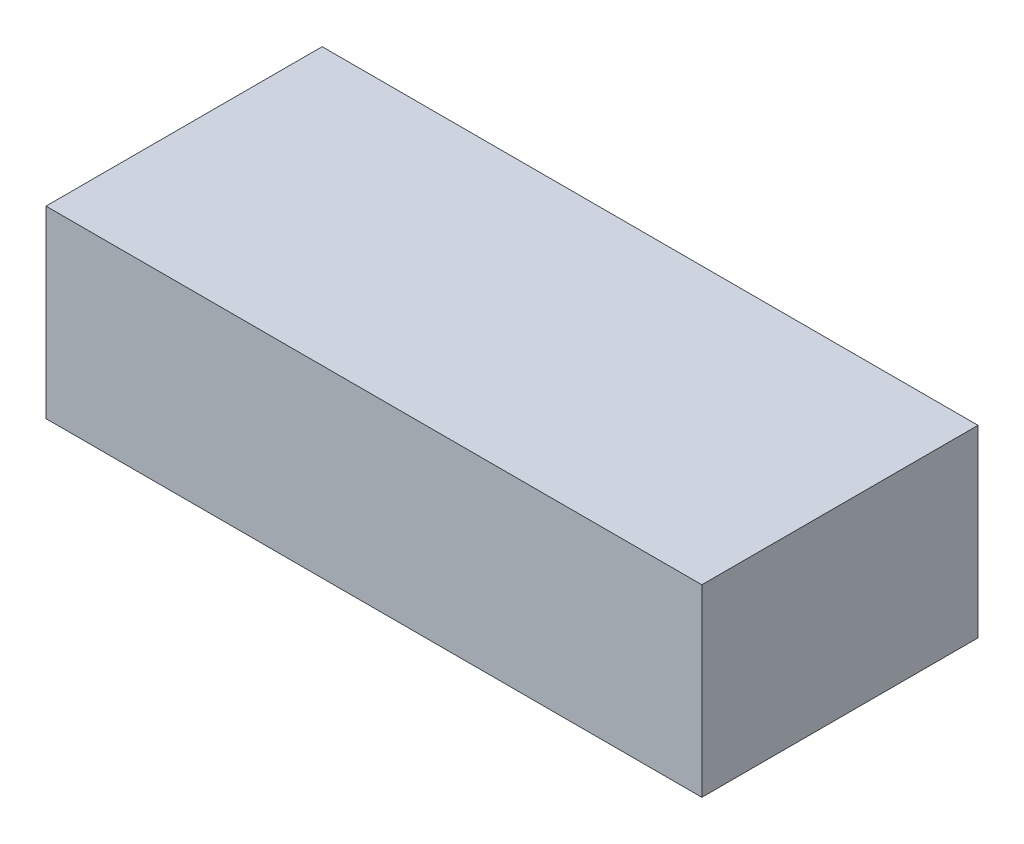
ISO-10303-21;
HEADER;
FILE_DESCRIPTION(('STEP AP214'),'2;1');
FILE_NAME('part.step','',(''),(''),'','','');
FILE_SCHEMA(('AUTOMOTIVE_DESIGN { 1 0 10303 214 1 1 1 1 }'));
ENDSEC;
DATA;
#1=APPLICATION_CONTEXT('core data for automotive mechanical design processes');
#2=APPLICATION_PROTOCOL_DEFINITION('international standard','automotive_design',2000,#1);
#3=PRODUCT_CONTEXT('',#1,'mechanical');
#4=PRODUCT('Part','Part','',(#3));
#5=PRODUCT_RELATED_PRODUCT_CATEGORY('part','',(#4));
#6=PRODUCT_DEFINITION_FORMATION('','',#4);
#7=PRODUCT_DEFINITION_CONTEXT('part definition',#1,'design');
#8=PRODUCT_DEFINITION('design','',#6,#7);
#9=PRODUCT_DEFINITION_SHAPE('','',#8);
#10=(LENGTH_UNIT() NAMED_UNIT(*) SI_UNIT(.MILLI.,.METRE.));
#11=(NAMED_UNIT(*) PLANE_ANGLE_UNIT() SI_UNIT($,.RADIAN.));
#12=(NAMED_UNIT(*) SI_UNIT($,.STERADIAN.) SOLID_ANGLE_UNIT());
#13=UNCERTAINTY_MEASURE_WITH_UNIT(LENGTH_MEASURE(1.E-05),#10,'distance_accuracy_value','');
#14=(GEOMETRIC_REPRESENTATION_CONTEXT(3) GLOBAL_UNCERTAINTY_ASSIGNED_CONTEXT((#13)) GLOBAL_UNIT_ASSIGNED_CONTEXT((#10,
#11,#12)) REPRESENTATION_CONTEXT('',''));
#15=CARTESIAN_POINT('',(0.,0.,0.));
#16=DIRECTION('',(0.,0.,1.));
#17=DIRECTION('',(1.,0.,0.));
#18=AXIS2_PLACEMENT_3D('',#15,#16,#17);
#19=CARTESIAN_POINT('',(0.,101.6,0.));
#20=DIRECTION('',(1.,0.,0.));
#21=DIRECTION('',(0.,0.,-1.));
#22=AXIS2_PLACEMENT_3D('',#19,#20,#21);
#23=PLANE('',#22);
#24=DIRECTION('',(0.,0.,1.));
#25=VECTOR('',#24,1.);
#26=CARTESIAN_POINT('',(0.,0.,0.));
#27=LINE('',#26,#25);
#28=CARTESIAN_POINT('',(0.,0.,-152.4));
#29=VERTEX_POINT('',#28);
#30=CARTESIAN_POINT('',(0.,0.,0.));
#31=VERTEX_POINT('',#30);
#32=EDGE_CURVE('E102',#29,#31,#27,.T.);
#33=ORIENTED_EDGE('',*,*,#32,.T.);
#34=DIRECTION('',(0.,-1.,0.));
#35=VECTOR('',#34,1.);
#36=CARTESIAN_POINT('',(0.,101.6,0.));
#37=LINE('',#36,#35);
#38=CARTESIAN_POINT('',(0.,101.6,0.));
#39=VERTEX_POINT('',#38);
#40=EDGE_CURVE('E11',#39,#31,#37,.T.);
#41=ORIENTED_EDGE('',*,*,#40,.F.);
#42=DIRECTION('',(0.,0.,1.));
#43=VECTOR('',#42,1.);
#44=CARTESIAN_POINT('',(0.,101.6,0.));
#45=LINE('',#44,#43);
#46=CARTESIAN_POINT('',(0.,101.6,-152.4));
#47=VERTEX_POINT('',#46);
#48=EDGE_CURVE('E90',#47,#39,#45,.T.);
#49=ORIENTED_EDGE('',*,*,#48,.F.);
#50=DIRECTION('',(0.,-1.,0.));
#51=VECTOR('',#50,1.);
#52=CARTESIAN_POINT('',(0.,101.6,-152.4));
#53=LINE('',#52,#51);
#54=EDGE_CURVE('E98',#47,#29,#53,.T.);
#55=ORIENTED_EDGE('',*,*,#54,.T.);
#56=EDGE_LOOP('',(#33,#41,#49,#55));
#57=FACE_BOUND('',#56,.T.);
#58=ADVANCED_FACE('F39',(#57),#23,.F.);
#59=CARTESIAN_POINT('',(0.,101.6,0.));
#60=DIRECTION('',(0.,0.,-1.));
#61=DIRECTION('',(-1.,0.,0.));
#62=AXIS2_PLACEMENT_3D('',#59,#60,#61);
#63=PLANE('',#62);
#64=DIRECTION('',(1.,0.,0.));
#65=VECTOR('',#64,1.);
#66=CARTESIAN_POINT('',(0.,0.,0.));
#67=LINE('',#66,#65);
#68=CARTESIAN_POINT('',(361.95,0.,0.));
#69=VERTEX_POINT('',#68);
#70=EDGE_CURVE('E94',#31,#69,#67,.T.);
#71=ORIENTED_EDGE('',*,*,#70,.T.);
#72=DIRECTION('',(0.,-1.,0.));
#73=VECTOR('',#72,1.);
#74=CARTESIAN_POINT('',(361.95,101.6,0.));
#75=LINE('',#74,#73);
#76=CARTESIAN_POINT('',(361.95,101.6,0.));
#77=VERTEX_POINT('',#76);
#78=EDGE_CURVE('E47',#77,#69,#75,.T.);
#79=ORIENTED_EDGE('',*,*,#78,.F.);
#80=DIRECTION('',(1.,0.,0.));
#81=VECTOR('',#80,1.);
#82=CARTESIAN_POINT('',(0.,101.6,0.));
#83=LINE('',#82,#81);
#84=EDGE_CURVE('E85',#39,#77,#83,.T.);
#85=ORIENTED_EDGE('',*,*,#84,.F.);
#86=ORIENTED_EDGE('',*,*,#40,.T.);
#87=EDGE_LOOP('',(#71,#79,#85,#86));
#88=FACE_BOUND('',#87,.T.);
#89=ADVANCED_FACE('F93',(#88),#63,.F.);
#90=CARTESIAN_POINT('',(361.95,101.6,0.));
#91=DIRECTION('',(-1.,0.,0.));
#92=DIRECTION('',(0.,0.,1.));
#93=AXIS2_PLACEMENT_3D('',#90,#91,#92);
#94=PLANE('',#93);
#95=DIRECTION('',(0.,0.,-1.));
#96=VECTOR('',#95,1.);
#97=CARTESIAN_POINT('',(361.95,0.,0.));
#98=LINE('',#97,#96);
#99=CARTESIAN_POINT('',(361.95,0.,-152.4));
#100=VERTEX_POINT('',#99);
#101=EDGE_CURVE('E72',#69,#100,#98,.T.);
#102=ORIENTED_EDGE('',*,*,#101,.T.);
#103=DIRECTION('',(0.,-1.,0.));
#104=VECTOR('',#103,1.);
#105=CARTESIAN_POINT('',(361.95,101.6,-152.4));
#106=LINE('',#105,#104);
#107=CARTESIAN_POINT('',(361.95,101.6,-152.4));
#108=VERTEX_POINT('',#107);
#109=EDGE_CURVE('E95',#108,#100,#106,.T.);
#110=ORIENTED_EDGE('',*,*,#109,.F.);
#111=DIRECTION('',(0.,0.,-1.));
#112=VECTOR('',#111,1.);
#113=CARTESIAN_POINT('',(361.95,101.6,0.));
#114=LINE('',#113,#112);
#115=EDGE_CURVE('E88',#77,#108,#114,.T.);
#116=ORIENTED_EDGE('',*,*,#115,.F.);
#117=ORIENTED_EDGE('',*,*,#78,.T.);
#118=EDGE_LOOP('',(#102,#110,#116,#117));
#119=FACE_BOUND('',#118,.T.);
#120=ADVANCED_FACE('F96',(#119),#94,.F.);
#121=CARTESIAN_POINT('',(0.,101.6,-152.4));
#122=DIRECTION('',(0.,0.,1.));
#123=DIRECTION('',(1.,0.,0.));
#124=AXIS2_PLACEMENT_3D('',#121,#122,#123);
#125=PLANE('',#124);
#126=DIRECTION('',(-1.,0.,0.));
#127=VECTOR('',#126,1.);
#128=CARTESIAN_POINT('',(0.,0.,-152.4));
#129=LINE('',#128,#127);
#130=EDGE_CURVE('E78',#100,#29,#129,.T.);
#131=ORIENTED_EDGE('',*,*,#130,.T.);
#132=ORIENTED_EDGE('',*,*,#54,.F.);
#133=DIRECTION('',(-1.,0.,0.));
#134=VECTOR('',#133,1.);
#135=CARTESIAN_POINT('',(0.,101.6,-152.4));
#136=LINE('',#135,#134);
#137=EDGE_CURVE('E55',#108,#47,#136,.T.);
#138=ORIENTED_EDGE('',*,*,#137,.F.);
#139=ORIENTED_EDGE('',*,*,#109,.T.);
#140=EDGE_LOOP('',(#131,#132,#138,#139));
#141=FACE_BOUND('',#140,.T.);
#142=ADVANCED_FACE('F109',(#141),#125,.F.);
#143=CARTESIAN_POINT('',(0.,101.6,0.));
#144=DIRECTION('',(0.,-1.,0.));
#145=DIRECTION('',(0.,0.,-1.));
#146=AXIS2_PLACEMENT_3D('',#143,#144,#145);
#147=PLANE('',#146);
#148=ORIENTED_EDGE('',*,*,#48,.T.);
#149=ORIENTED_EDGE('',*,*,#84,.T.);
#150=ORIENTED_EDGE('',*,*,#115,.T.);
#151=ORIENTED_EDGE('',*,*,#137,.T.);
#152=EDGE_LOOP('',(#148,#149,#150,#151));
#153=FACE_BOUND('',#152,.T.);
#154=ADVANCED_FACE('F86',(#153),#147,.F.);
#155=CARTESIAN_POINT('',(0.,0.,0.));
#156=DIRECTION('',(0.,-1.,0.));
#157=DIRECTION('',(0.,0.,-1.));
#158=AXIS2_PLACEMENT_3D('',#155,#156,#157);
#159=PLANE('',#158);
#160=ORIENTED_EDGE('',*,*,#32,.F.);
#161=ORIENTED_EDGE('',*,*,#130,.F.);
#162=ORIENTED_EDGE('',*,*,#101,.F.);
#163=ORIENTED_EDGE('',*,*,#70,.F.);
#164=EDGE_LOOP('',(#160,#161,#162,#163));
#165=FACE_BOUND('',#164,.T.);
#166=ADVANCED_FACE('F112',(#165),#159,.T.);
#167=CLOSED_SHELL('',(#58,#89,#120,#142,#154,#166));
#168=MANIFOLD_SOLID_BREP('B2',#167);
#169=ADVANCED_BREP_SHAPE_REPRESENTATION('',(#18,#168),#14);
#170=SHAPE_DEFINITION_REPRESENTATION(#9,#169);
ENDSEC;
END-ISO-10303-21;
